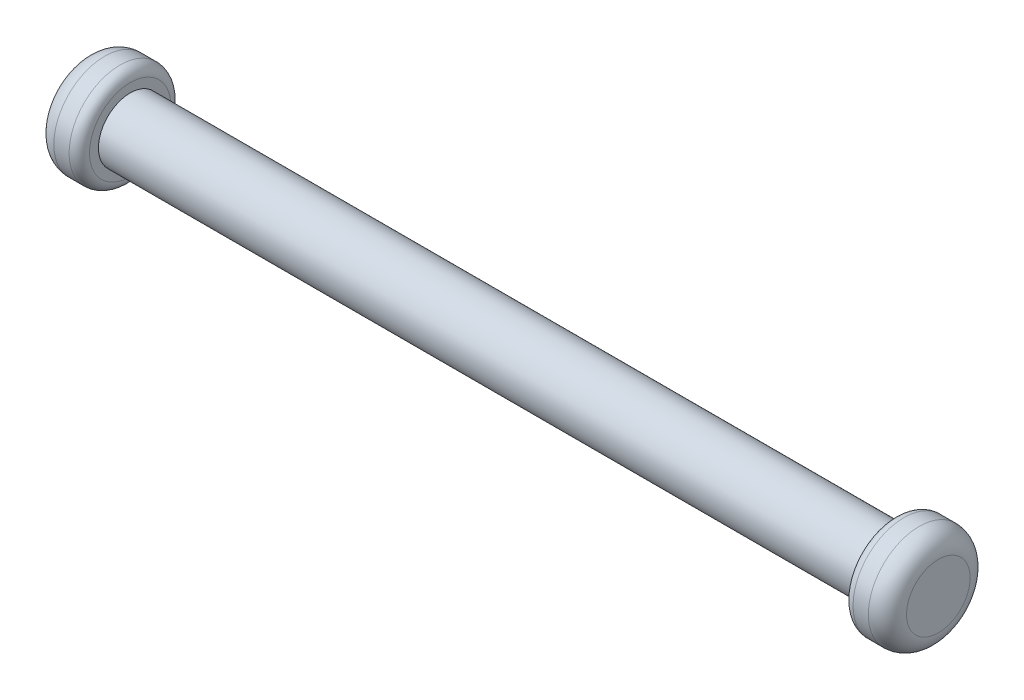
ISO-10303-21;
HEADER;
FILE_DESCRIPTION(('STEP AP214'),'2;1');
FILE_NAME('part.step','',(''),(''),'','','');
FILE_SCHEMA(('AUTOMOTIVE_DESIGN { 1 0 10303 214 1 1 1 1 }'));
ENDSEC;
DATA;
#1=APPLICATION_CONTEXT('core data for automotive mechanical design processes');
#2=APPLICATION_PROTOCOL_DEFINITION('international standard','automotive_design',2000,#1);
#3=PRODUCT_CONTEXT('',#1,'mechanical');
#4=PRODUCT('Part','Part','',(#3));
#5=PRODUCT_RELATED_PRODUCT_CATEGORY('part','',(#4));
#6=PRODUCT_DEFINITION_FORMATION('','',#4);
#7=PRODUCT_DEFINITION_CONTEXT('part definition',#1,'design');
#8=PRODUCT_DEFINITION('design','',#6,#7);
#9=PRODUCT_DEFINITION_SHAPE('','',#8);
#10=(LENGTH_UNIT() NAMED_UNIT(*) SI_UNIT(.MILLI.,.METRE.));
#11=(NAMED_UNIT(*) PLANE_ANGLE_UNIT() SI_UNIT($,.RADIAN.));
#12=(NAMED_UNIT(*) SI_UNIT($,.STERADIAN.) SOLID_ANGLE_UNIT());
#13=UNCERTAINTY_MEASURE_WITH_UNIT(LENGTH_MEASURE(1.E-05),#10,'distance_accuracy_value','');
#14=(GEOMETRIC_REPRESENTATION_CONTEXT(3) GLOBAL_UNCERTAINTY_ASSIGNED_CONTEXT((#13)) GLOBAL_UNIT_ASSIGNED_CONTEXT((#10,
#11,#12)) REPRESENTATION_CONTEXT('',''));
#15=CARTESIAN_POINT('',(0.,0.,0.));
#16=DIRECTION('',(0.,0.,1.));
#17=DIRECTION('',(1.,0.,0.));
#18=AXIS2_PLACEMENT_3D('',#15,#16,#17);
#19=CARTESIAN_POINT('',(0.,0.,0.));
#20=DIRECTION('',(-1.,0.,0.));
#21=DIRECTION('',(0.,0.,1.));
#22=AXIS2_PLACEMENT_3D('',#19,#20,#21);
#23=PLANE('',#22);
#24=CARTESIAN_POINT('',(0.,0.,0.));
#25=DIRECTION('',(-1.,0.,0.));
#26=DIRECTION('',(0.,0.,1.));
#27=AXIS2_PLACEMENT_3D('',#24,#25,#26);
#28=CIRCLE('',#27,2.5);
#29=CARTESIAN_POINT('',(0.,0.,2.5));
#30=VERTEX_POINT('',#29);
#31=EDGE_CURVE('E10',#30,#30,#28,.T.);
#32=ORIENTED_EDGE('',*,*,#31,.T.);
#33=EDGE_LOOP('',(#32));
#34=FACE_BOUND('',#33,.T.);
#35=ADVANCED_FACE('F33',(#34),#23,.T.);
#36=CARTESIAN_POINT('',(0.,0.,0.));
#37=DIRECTION('',(1.,0.,0.));
#38=DIRECTION('',(0.,0.,-1.));
#39=AXIS2_PLACEMENT_3D('',#36,#37,#38);
#40=CYLINDRICAL_SURFACE('',#39,4.);
#41=CARTESIAN_POINT('',(1.5,0.,0.));
#42=DIRECTION('',(-1.,0.,0.));
#43=DIRECTION('',(0.,0.,1.));
#44=AXIS2_PLACEMENT_3D('',#41,#42,#43);
#45=CIRCLE('',#44,4.);
#46=CARTESIAN_POINT('',(1.5,0.,4.));
#47=VERTEX_POINT('',#46);
#48=EDGE_CURVE('E40',#47,#47,#45,.F.);
#49=ORIENTED_EDGE('',*,*,#48,.T.);
#50=EDGE_LOOP('',(#49));
#51=FACE_BOUND('',#50,.T.);
#52=CARTESIAN_POINT('',(2.7,0.,0.));
#53=DIRECTION('',(1.,0.,0.));
#54=DIRECTION('',(0.,0.,-1.));
#55=AXIS2_PLACEMENT_3D('',#52,#53,#54);
#56=CIRCLE('',#55,4.);
#57=CARTESIAN_POINT('',(2.7,0.,-4.));
#58=VERTEX_POINT('',#57);
#59=EDGE_CURVE('E53',#58,#58,#56,.F.);
#60=ORIENTED_EDGE('',*,*,#59,.T.);
#61=EDGE_LOOP('',(#60));
#62=FACE_BOUND('',#61,.T.);
#63=ADVANCED_FACE('F86',(#51,#62),#40,.T.);
#64=CARTESIAN_POINT('',(3.5,4.,0.));
#65=DIRECTION('',(1.,0.,0.));
#66=DIRECTION('',(0.,0.,-1.));
#67=AXIS2_PLACEMENT_3D('',#64,#65,#66);
#68=PLANE('',#67);
#69=CARTESIAN_POINT('',(3.5,0.,0.));
#70=DIRECTION('',(1.,0.,0.));
#71=DIRECTION('',(0.,0.,-1.));
#72=AXIS2_PLACEMENT_3D('',#69,#70,#71);
#73=CIRCLE('',#72,3.2);
#74=CARTESIAN_POINT('',(3.5,0.,-3.2));
#75=VERTEX_POINT('',#74);
#76=EDGE_CURVE('E56',#75,#75,#73,.T.);
#77=ORIENTED_EDGE('',*,*,#76,.T.);
#78=EDGE_LOOP('',(#77));
#79=FACE_BOUND('',#78,.T.);
#80=CARTESIAN_POINT('',(3.5,0.,0.));
#81=DIRECTION('',(1.,0.,0.));
#82=DIRECTION('',(0.,0.,-1.));
#83=AXIS2_PLACEMENT_3D('',#80,#81,#82);
#84=CIRCLE('',#83,2.5);
#85=CARTESIAN_POINT('',(3.5,0.,-2.5));
#86=VERTEX_POINT('',#85);
#87=EDGE_CURVE('E65',#86,#86,#84,.T.);
#88=ORIENTED_EDGE('',*,*,#87,.F.);
#89=EDGE_LOOP('',(#88));
#90=FACE_BOUND('',#89,.T.);
#91=ADVANCED_FACE('F76',(#79,#90),#68,.T.);
#92=CARTESIAN_POINT('',(0.,0.,0.));
#93=DIRECTION('',(1.,0.,0.));
#94=DIRECTION('',(0.,0.,-1.));
#95=AXIS2_PLACEMENT_3D('',#92,#93,#94);
#96=CYLINDRICAL_SURFACE('',#95,2.5);
#97=ORIENTED_EDGE('',*,*,#87,.T.);
#98=EDGE_LOOP('',(#97));
#99=FACE_BOUND('',#98,.T.);
#100=CARTESIAN_POINT('',(63.5,0.,0.));
#101=DIRECTION('',(1.,0.,0.));
#102=DIRECTION('',(0.,0.,-1.));
#103=AXIS2_PLACEMENT_3D('',#100,#101,#102);
#104=CIRCLE('',#103,2.5);
#105=CARTESIAN_POINT('',(63.5,0.,-2.5));
#106=VERTEX_POINT('',#105);
#107=EDGE_CURVE('E68',#106,#106,#104,.T.);
#108=ORIENTED_EDGE('',*,*,#107,.F.);
#109=EDGE_LOOP('',(#108));
#110=FACE_BOUND('',#109,.T.);
#111=ADVANCED_FACE('F74',(#99,#110),#96,.T.);
#112=CARTESIAN_POINT('',(63.5,2.5,0.));
#113=DIRECTION('',(-1.,0.,0.));
#114=DIRECTION('',(0.,0.,1.));
#115=AXIS2_PLACEMENT_3D('',#112,#113,#114);
#116=PLANE('',#115);
#117=CARTESIAN_POINT('',(63.5,0.,0.));
#118=DIRECTION('',(-1.,0.,0.));
#119=DIRECTION('',(0.,0.,1.));
#120=AXIS2_PLACEMENT_3D('',#117,#118,#119);
#121=CIRCLE('',#120,3.20000000000001);
#122=CARTESIAN_POINT('',(63.5,0.,3.20000000000001));
#123=VERTEX_POINT('',#122);
#124=EDGE_CURVE('E59',#123,#123,#121,.T.);
#125=ORIENTED_EDGE('',*,*,#124,.T.);
#126=EDGE_LOOP('',(#125));
#127=FACE_BOUND('',#126,.T.);
#128=ORIENTED_EDGE('',*,*,#107,.T.);
#129=EDGE_LOOP('',(#128));
#130=FACE_BOUND('',#129,.T.);
#131=ADVANCED_FACE('F72',(#127,#130),#116,.T.);
#132=CARTESIAN_POINT('',(0.,0.,0.));
#133=DIRECTION('',(1.,0.,0.));
#134=DIRECTION('',(0.,0.,-1.));
#135=AXIS2_PLACEMENT_3D('',#132,#133,#134);
#136=CYLINDRICAL_SURFACE('',#135,4.00000000000001);
#137=CARTESIAN_POINT('',(65.5,0.,0.));
#138=DIRECTION('',(1.,0.,0.));
#139=DIRECTION('',(0.,0.,-1.));
#140=AXIS2_PLACEMENT_3D('',#137,#138,#139);
#141=CIRCLE('',#140,4.00000000000001);
#142=CARTESIAN_POINT('',(65.5,0.,-4.00000000000001));
#143=VERTEX_POINT('',#142);
#144=EDGE_CURVE('E44',#143,#143,#141,.F.);
#145=ORIENTED_EDGE('',*,*,#144,.T.);
#146=EDGE_LOOP('',(#145));
#147=FACE_BOUND('',#146,.T.);
#148=CARTESIAN_POINT('',(64.3,0.,0.));
#149=DIRECTION('',(-1.,0.,0.));
#150=DIRECTION('',(0.,0.,1.));
#151=AXIS2_PLACEMENT_3D('',#148,#149,#150);
#152=CIRCLE('',#151,4.00000000000001);
#153=CARTESIAN_POINT('',(64.3,0.,4.00000000000001));
#154=VERTEX_POINT('',#153);
#155=EDGE_CURVE('E62',#154,#154,#152,.F.);
#156=ORIENTED_EDGE('',*,*,#155,.T.);
#157=EDGE_LOOP('',(#156));
#158=FACE_BOUND('',#157,.T.);
#159=ADVANCED_FACE('F83',(#147,#158),#136,.T.);
#160=CARTESIAN_POINT('',(67.,4.00000000000001,0.));
#161=DIRECTION('',(1.,0.,0.));
#162=DIRECTION('',(0.,0.,-1.));
#163=AXIS2_PLACEMENT_3D('',#160,#161,#162);
#164=PLANE('',#163);
#165=CARTESIAN_POINT('',(67.,0.,0.));
#166=DIRECTION('',(1.,0.,0.));
#167=DIRECTION('',(0.,0.,-1.));
#168=AXIS2_PLACEMENT_3D('',#165,#166,#167);
#169=CIRCLE('',#168,2.50000000000001);
#170=CARTESIAN_POINT('',(67.,0.,-2.50000000000001));
#171=VERTEX_POINT('',#170);
#172=EDGE_CURVE('E48',#171,#171,#169,.T.);
#173=ORIENTED_EDGE('',*,*,#172,.T.);
#174=EDGE_LOOP('',(#173));
#175=FACE_BOUND('',#174,.T.);
#176=ADVANCED_FACE('F100',(#175),#164,.T.);
#177=CARTESIAN_POINT('',(64.3,0.,0.));
#178=DIRECTION('',(-1.,0.,0.));
#179=DIRECTION('',(0.,0.,1.));
#180=AXIS2_PLACEMENT_3D('',#177,#178,#179);
#181=TOROIDAL_SURFACE('',#180,3.20000000000001,0.8);
#182=ORIENTED_EDGE('',*,*,#124,.F.);
#183=EDGE_LOOP('',(#182));
#184=FACE_BOUND('',#183,.T.);
#185=ORIENTED_EDGE('',*,*,#155,.F.);
#186=EDGE_LOOP('',(#185));
#187=FACE_BOUND('',#186,.T.);
#188=ADVANCED_FACE('F96',(#184,#187),#181,.T.);
#189=CARTESIAN_POINT('',(2.7,0.,0.));
#190=DIRECTION('',(1.,0.,0.));
#191=DIRECTION('',(0.,0.,-1.));
#192=AXIS2_PLACEMENT_3D('',#189,#190,#191);
#193=TOROIDAL_SURFACE('',#192,3.2,0.8);
#194=ORIENTED_EDGE('',*,*,#59,.F.);
#195=EDGE_LOOP('',(#194));
#196=FACE_BOUND('',#195,.T.);
#197=ORIENTED_EDGE('',*,*,#76,.F.);
#198=EDGE_LOOP('',(#197));
#199=FACE_BOUND('',#198,.T.);
#200=ADVANCED_FACE('F99',(#196,#199),#193,.T.);
#201=CARTESIAN_POINT('',(65.5,0.,0.));
#202=DIRECTION('',(1.,0.,0.));
#203=DIRECTION('',(0.,0.,-1.));
#204=AXIS2_PLACEMENT_3D('',#201,#202,#203);
#205=TOROIDAL_SURFACE('',#204,2.50000000000001,1.5);
#206=ORIENTED_EDGE('',*,*,#144,.F.);
#207=EDGE_LOOP('',(#206));
#208=FACE_BOUND('',#207,.T.);
#209=ORIENTED_EDGE('',*,*,#172,.F.);
#210=EDGE_LOOP('',(#209));
#211=FACE_BOUND('',#210,.T.);
#212=ADVANCED_FACE('F103',(#208,#211),#205,.T.);
#213=CARTESIAN_POINT('',(1.5,0.,0.));
#214=DIRECTION('',(-1.,0.,0.));
#215=DIRECTION('',(0.,0.,1.));
#216=AXIS2_PLACEMENT_3D('',#213,#214,#215);
#217=TOROIDAL_SURFACE('',#216,2.5,1.5);
#218=ORIENTED_EDGE('',*,*,#31,.F.);
#219=EDGE_LOOP('',(#218));
#220=FACE_BOUND('',#219,.T.);
#221=ORIENTED_EDGE('',*,*,#48,.F.);
#222=EDGE_LOOP('',(#221));
#223=FACE_BOUND('',#222,.T.);
#224=ADVANCED_FACE('F35',(#220,#223),#217,.T.);
#225=CLOSED_SHELL('',(#35,#63,#91,#111,#131,#159,#176,#188,#200,#212,#224));
#226=MANIFOLD_SOLID_BREP('B2',#225);
#227=ADVANCED_BREP_SHAPE_REPRESENTATION('',(#18,#226),#14);
#228=SHAPE_DEFINITION_REPRESENTATION(#9,#227);
ENDSEC;
END-ISO-10303-21;
